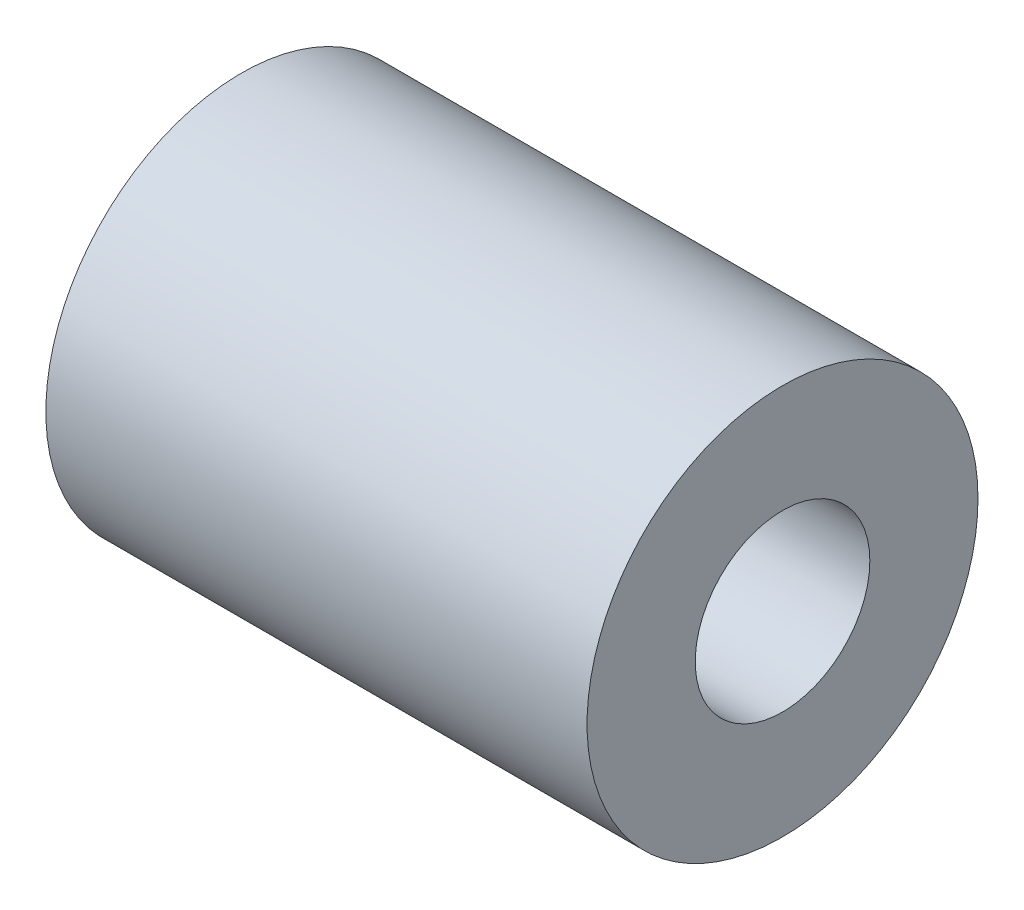
ISO-10303-21;
HEADER;
FILE_DESCRIPTION(('STEP AP214'),'2;1');
FILE_NAME('part.step','',(''),(''),'','','');
FILE_SCHEMA(('AUTOMOTIVE_DESIGN { 1 0 10303 214 1 1 1 1 }'));
ENDSEC;
DATA;
#1=APPLICATION_CONTEXT('core data for automotive mechanical design processes');
#2=APPLICATION_PROTOCOL_DEFINITION('international standard','automotive_design',2000,#1);
#3=PRODUCT_CONTEXT('',#1,'mechanical');
#4=PRODUCT('Part','Part','',(#3));
#5=PRODUCT_RELATED_PRODUCT_CATEGORY('part','',(#4));
#6=PRODUCT_DEFINITION_FORMATION('','',#4);
#7=PRODUCT_DEFINITION_CONTEXT('part definition',#1,'design');
#8=PRODUCT_DEFINITION('design','',#6,#7);
#9=PRODUCT_DEFINITION_SHAPE('','',#8);
#10=(LENGTH_UNIT() NAMED_UNIT(*) SI_UNIT(.MILLI.,.METRE.));
#11=(NAMED_UNIT(*) PLANE_ANGLE_UNIT() SI_UNIT($,.RADIAN.));
#12=(NAMED_UNIT(*) SI_UNIT($,.STERADIAN.) SOLID_ANGLE_UNIT());
#13=UNCERTAINTY_MEASURE_WITH_UNIT(LENGTH_MEASURE(1.E-05),#10,'distance_accuracy_value','');
#14=(GEOMETRIC_REPRESENTATION_CONTEXT(3) GLOBAL_UNCERTAINTY_ASSIGNED_CONTEXT((#13)) GLOBAL_UNIT_ASSIGNED_CONTEXT((#10,
#11,#12)) REPRESENTATION_CONTEXT('',''));
#15=CARTESIAN_POINT('',(0.,0.,0.));
#16=DIRECTION('',(0.,0.,1.));
#17=DIRECTION('',(1.,0.,0.));
#18=AXIS2_PLACEMENT_3D('',#15,#16,#17);
#19=CARTESIAN_POINT('',(15.8242,0.,0.));
#20=DIRECTION('',(1.,0.,0.));
#21=DIRECTION('',(0.,0.,-1.));
#22=AXIS2_PLACEMENT_3D('',#19,#20,#21);
#23=PLANE('',#22);
#24=CARTESIAN_POINT('',(15.8242,0.,0.));
#25=DIRECTION('',(1.,0.,0.));
#26=DIRECTION('',(0.,0.,-1.));
#27=AXIS2_PLACEMENT_3D('',#24,#25,#26);
#28=CIRCLE('',#27,5.715);
#29=CARTESIAN_POINT('',(15.8242,0.,-5.715));
#30=VERTEX_POINT('',#29);
#31=EDGE_CURVE('E10',#30,#30,#28,.T.);
#32=ORIENTED_EDGE('',*,*,#31,.T.);
#33=EDGE_LOOP('',(#32));
#34=FACE_BOUND('',#33,.T.);
#35=CARTESIAN_POINT('',(15.8242,0.,0.));
#36=DIRECTION('',(1.,0.,0.));
#37=DIRECTION('',(0.,0.,-1.));
#38=AXIS2_PLACEMENT_3D('',#35,#36,#37);
#39=CIRCLE('',#38,2.5527);
#40=CARTESIAN_POINT('',(15.8242,0.,-2.5527));
#41=VERTEX_POINT('',#40);
#42=EDGE_CURVE('E42',#41,#41,#39,.T.);
#43=ORIENTED_EDGE('',*,*,#42,.F.);
#44=EDGE_LOOP('',(#43));
#45=FACE_BOUND('',#44,.T.);
#46=ADVANCED_FACE('F31',(#34,#45),#23,.T.);
#47=CARTESIAN_POINT('',(0.,0.,0.));
#48=DIRECTION('',(1.,0.,0.));
#49=DIRECTION('',(0.,0.,-1.));
#50=AXIS2_PLACEMENT_3D('',#47,#48,#49);
#51=PLANE('',#50);
#52=CARTESIAN_POINT('',(0.,0.,0.));
#53=DIRECTION('',(1.,0.,0.));
#54=DIRECTION('',(0.,0.,-1.));
#55=AXIS2_PLACEMENT_3D('',#52,#53,#54);
#56=CIRCLE('',#55,5.715);
#57=CARTESIAN_POINT('',(0.,0.,-5.715));
#58=VERTEX_POINT('',#57);
#59=EDGE_CURVE('E35',#58,#58,#56,.T.);
#60=ORIENTED_EDGE('',*,*,#59,.F.);
#61=EDGE_LOOP('',(#60));
#62=FACE_BOUND('',#61,.T.);
#63=CARTESIAN_POINT('',(0.,0.,0.));
#64=DIRECTION('',(1.,0.,0.));
#65=DIRECTION('',(0.,0.,-1.));
#66=AXIS2_PLACEMENT_3D('',#63,#64,#65);
#67=CIRCLE('',#66,2.5527);
#68=CARTESIAN_POINT('',(0.,0.,-2.5527));
#69=VERTEX_POINT('',#68);
#70=EDGE_CURVE('E44',#69,#69,#67,.T.);
#71=ORIENTED_EDGE('',*,*,#70,.T.);
#72=EDGE_LOOP('',(#71));
#73=FACE_BOUND('',#72,.T.);
#74=ADVANCED_FACE('F54',(#62,#73),#51,.F.);
#75=CARTESIAN_POINT('',(15.8242,0.,0.));
#76=DIRECTION('',(-1.,0.,0.));
#77=DIRECTION('',(0.,0.,1.));
#78=AXIS2_PLACEMENT_3D('',#75,#76,#77);
#79=CYLINDRICAL_SURFACE('',#78,5.715);
#80=ORIENTED_EDGE('',*,*,#31,.F.);
#81=EDGE_LOOP('',(#80));
#82=FACE_BOUND('',#81,.T.);
#83=ORIENTED_EDGE('',*,*,#59,.T.);
#84=EDGE_LOOP('',(#83));
#85=FACE_BOUND('',#84,.T.);
#86=ADVANCED_FACE('F33',(#82,#85),#79,.T.);
#87=CARTESIAN_POINT('',(15.8242,0.,0.));
#88=DIRECTION('',(-1.,0.,0.));
#89=DIRECTION('',(0.,0.,1.));
#90=AXIS2_PLACEMENT_3D('',#87,#88,#89);
#91=CYLINDRICAL_SURFACE('',#90,2.5527);
#92=ORIENTED_EDGE('',*,*,#42,.T.);
#93=EDGE_LOOP('',(#92));
#94=FACE_BOUND('',#93,.T.);
#95=ORIENTED_EDGE('',*,*,#70,.F.);
#96=EDGE_LOOP('',(#95));
#97=FACE_BOUND('',#96,.T.);
#98=ADVANCED_FACE('F50',(#94,#97),#91,.F.);
#99=CLOSED_SHELL('',(#46,#74,#86,#98));
#100=MANIFOLD_SOLID_BREP('B2',#99);
#101=ADVANCED_BREP_SHAPE_REPRESENTATION('',(#18,#100),#14);
#102=SHAPE_DEFINITION_REPRESENTATION(#9,#101);
ENDSEC;
END-ISO-10303-21;
